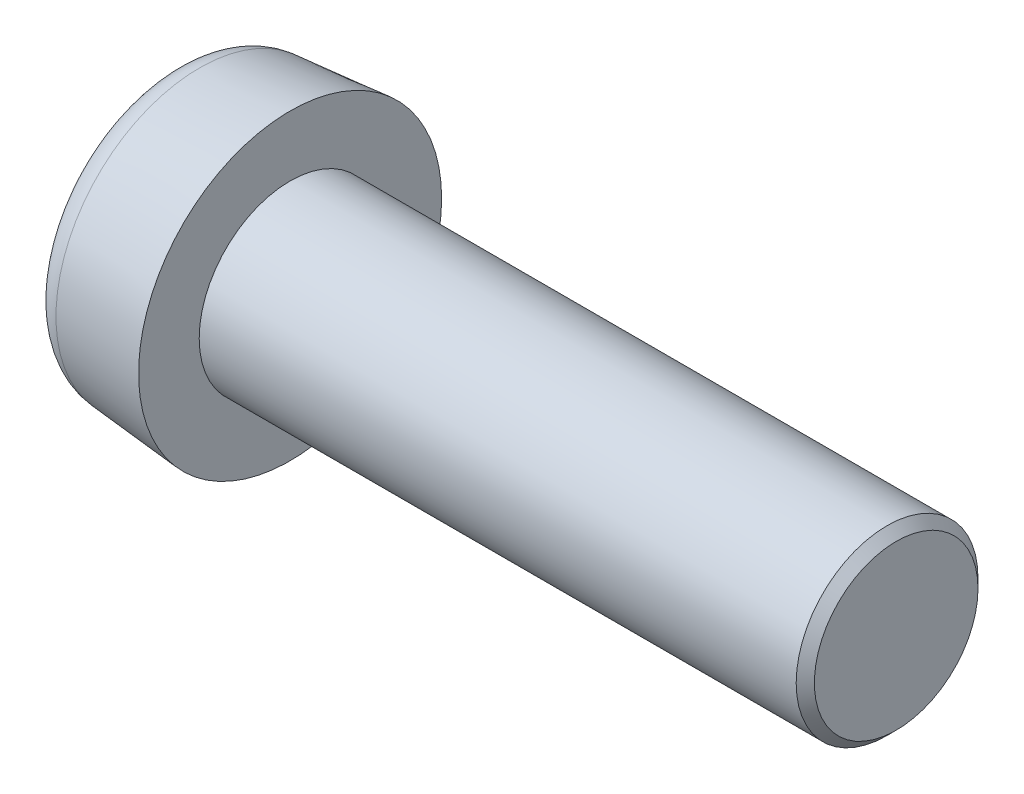
ISO-10303-21;
HEADER;
FILE_DESCRIPTION(('STEP AP214'),'2;1');
FILE_NAME('part.step','',(''),(''),'','','');
FILE_SCHEMA(('AUTOMOTIVE_DESIGN { 1 0 10303 214 1 1 1 1 }'));
ENDSEC;
DATA;
#1=APPLICATION_CONTEXT('core data for automotive mechanical design processes');
#2=APPLICATION_PROTOCOL_DEFINITION('international standard','automotive_design',2000,#1);
#3=PRODUCT_CONTEXT('',#1,'mechanical');
#4=PRODUCT('Part','Part','',(#3));
#5=PRODUCT_RELATED_PRODUCT_CATEGORY('part','',(#4));
#6=PRODUCT_DEFINITION_FORMATION('','',#4);
#7=PRODUCT_DEFINITION_CONTEXT('part definition',#1,'design');
#8=PRODUCT_DEFINITION('design','',#6,#7);
#9=PRODUCT_DEFINITION_SHAPE('','',#8);
#10=(LENGTH_UNIT() NAMED_UNIT(*) SI_UNIT(.MILLI.,.METRE.));
#11=(NAMED_UNIT(*) PLANE_ANGLE_UNIT() SI_UNIT($,.RADIAN.));
#12=(NAMED_UNIT(*) SI_UNIT($,.STERADIAN.) SOLID_ANGLE_UNIT());
#13=UNCERTAINTY_MEASURE_WITH_UNIT(LENGTH_MEASURE(1.E-05),#10,'distance_accuracy_value','');
#14=(GEOMETRIC_REPRESENTATION_CONTEXT(3) GLOBAL_UNCERTAINTY_ASSIGNED_CONTEXT((#13)) GLOBAL_UNIT_ASSIGNED_CONTEXT((#10,
#11,#12)) REPRESENTATION_CONTEXT('',''));
#15=CARTESIAN_POINT('',(0.,0.,0.));
#16=DIRECTION('',(0.,0.,1.));
#17=DIRECTION('',(1.,0.,0.));
#18=AXIS2_PLACEMENT_3D('',#15,#16,#17);
#19=CARTESIAN_POINT('',(0.,0.,0.));
#20=DIRECTION('',(1.,0.,0.));
#21=DIRECTION('',(0.,0.,-1.));
#22=AXIS2_PLACEMENT_3D('',#19,#20,#21);
#23=PLANE('',#22);
#24=CARTESIAN_POINT('',(0.,0.,0.));
#25=DIRECTION('',(1.,0.,0.));
#26=DIRECTION('',(0.,0.,-1.));
#27=AXIS2_PLACEMENT_3D('',#24,#25,#26);
#28=CIRCLE('',#27,3.74246303823147);
#29=CARTESIAN_POINT('',(0.,0.,-3.74246303823147));
#30=VERTEX_POINT('',#29);
#31=EDGE_CURVE('E136',#30,#30,#28,.F.);
#32=ORIENTED_EDGE('',*,*,#31,.T.);
#33=EDGE_LOOP('',(#32));
#34=FACE_BOUND('',#33,.T.);
#35=DIRECTION('',(0.,0.866025403784439,-0.5));
#36=VECTOR('',#35,1.);
#37=CARTESIAN_POINT('',(0.,-2.075,-1.19800180856848));
#38=LINE('',#37,#36);
#39=CARTESIAN_POINT('',(0.,-2.075,-1.19800180856848));
#40=VERTEX_POINT('',#39);
#41=CARTESIAN_POINT('',(0.,0.,-2.39600361713695));
#42=VERTEX_POINT('',#41);
#43=EDGE_CURVE('E52',#40,#42,#38,.T.);
#44=ORIENTED_EDGE('',*,*,#43,.T.);
#45=DIRECTION('',(0.,0.866025403784438,0.5));
#46=VECTOR('',#45,1.);
#47=CARTESIAN_POINT('',(0.,0.,-2.39600361713695));
#48=LINE('',#47,#46);
#49=CARTESIAN_POINT('',(0.,2.075,-1.19800180856847));
#50=VERTEX_POINT('',#49);
#51=EDGE_CURVE('E111',#42,#50,#48,.T.);
#52=ORIENTED_EDGE('',*,*,#51,.T.);
#53=DIRECTION('',(0.,0.,1.));
#54=VECTOR('',#53,1.);
#55=CARTESIAN_POINT('',(0.,2.075,-1.19800180856847));
#56=LINE('',#55,#54);
#57=CARTESIAN_POINT('',(0.,2.075,1.19800180856847));
#58=VERTEX_POINT('',#57);
#59=EDGE_CURVE('E109',#50,#58,#56,.T.);
#60=ORIENTED_EDGE('',*,*,#59,.T.);
#61=DIRECTION('',(0.,-0.866025403784438,0.5));
#62=VECTOR('',#61,1.);
#63=CARTESIAN_POINT('',(0.,2.075,1.19800180856847));
#64=LINE('',#63,#62);
#65=CARTESIAN_POINT('',(0.,0.,2.39600361713695));
#66=VERTEX_POINT('',#65);
#67=EDGE_CURVE('E88',#58,#66,#64,.T.);
#68=ORIENTED_EDGE('',*,*,#67,.T.);
#69=DIRECTION('',(0.,-0.866025403784438,-0.5));
#70=VECTOR('',#69,1.);
#71=CARTESIAN_POINT('',(0.,0.,2.39600361713695));
#72=LINE('',#71,#70);
#73=CARTESIAN_POINT('',(0.,-2.075,1.19800180856847));
#74=VERTEX_POINT('',#73);
#75=EDGE_CURVE('E99',#66,#74,#72,.T.);
#76=ORIENTED_EDGE('',*,*,#75,.T.);
#77=DIRECTION('',(0.,0.,-1.));
#78=VECTOR('',#77,1.);
#79=CARTESIAN_POINT('',(0.,-2.075,1.19800180856847));
#80=LINE('',#79,#78);
#81=EDGE_CURVE('E105',#74,#40,#80,.T.);
#82=ORIENTED_EDGE('',*,*,#81,.T.);
#83=EDGE_LOOP('',(#44,#52,#60,#68,#76,#82));
#84=FACE_BOUND('',#83,.T.);
#85=ADVANCED_FACE('F37',(#34,#84),#23,.F.);
#86=CARTESIAN_POINT('',(3.9,0.,0.));
#87=DIRECTION('',(1.,0.,0.));
#88=DIRECTION('',(0.,0.,-1.));
#89=AXIS2_PLACEMENT_3D('',#86,#87,#88);
#90=PLANE('',#89);
#91=CARTESIAN_POINT('',(3.9,0.,0.));
#92=DIRECTION('',(1.,0.,0.));
#93=DIRECTION('',(0.,0.,-1.));
#94=AXIS2_PLACEMENT_3D('',#91,#92,#93);
#95=CIRCLE('',#94,5.);
#96=CARTESIAN_POINT('',(3.9,0.,-5.));
#97=VERTEX_POINT('',#96);
#98=EDGE_CURVE('E129',#97,#97,#95,.T.);
#99=ORIENTED_EDGE('',*,*,#98,.T.);
#100=EDGE_LOOP('',(#99));
#101=FACE_BOUND('',#100,.T.);
#102=CARTESIAN_POINT('',(3.9,0.,0.));
#103=DIRECTION('',(1.,0.,0.));
#104=DIRECTION('',(0.,0.,-1.));
#105=AXIS2_PLACEMENT_3D('',#102,#103,#104);
#106=CIRCLE('',#105,3.);
#107=CARTESIAN_POINT('',(3.9,0.,-3.));
#108=VERTEX_POINT('',#107);
#109=EDGE_CURVE('E126',#108,#108,#106,.T.);
#110=ORIENTED_EDGE('',*,*,#109,.F.);
#111=EDGE_LOOP('',(#110));
#112=FACE_BOUND('',#111,.T.);
#113=ADVANCED_FACE('F153',(#101,#112),#90,.T.);
#114=CARTESIAN_POINT('',(3.9,0.,0.));
#115=DIRECTION('',(1.,0.,0.));
#116=DIRECTION('',(0.,0.,-1.));
#117=AXIS2_PLACEMENT_3D('',#114,#115,#116);
#118=CONICAL_SURFACE('',#117,5.,0.0872664625997167);
#119=CARTESIAN_POINT('',(0.912844257252342,0.,0.));
#120=DIRECTION('',(1.,0.,0.));
#121=DIRECTION('',(0.,0.,-1.));
#122=AXIS2_PLACEMENT_3D('',#119,#120,#121);
#123=CIRCLE('',#122,4.73865773632322);
#124=CARTESIAN_POINT('',(0.912844257252342,0.,-4.73865773632322));
#125=VERTEX_POINT('',#124);
#126=EDGE_CURVE('E133',#125,#125,#123,.T.);
#127=ORIENTED_EDGE('',*,*,#126,.T.);
#128=EDGE_LOOP('',(#127));
#129=FACE_BOUND('',#128,.T.);
#130=ORIENTED_EDGE('',*,*,#98,.F.);
#131=EDGE_LOOP('',(#130));
#132=FACE_BOUND('',#131,.T.);
#133=ADVANCED_FACE('F159',(#129,#132),#118,.T.);
#134=CARTESIAN_POINT('',(23.9,0.,0.));
#135=DIRECTION('',(-1.,0.,0.));
#136=DIRECTION('',(0.,0.,1.));
#137=AXIS2_PLACEMENT_3D('',#134,#135,#136);
#138=CYLINDRICAL_SURFACE('',#137,3.);
#139=CARTESIAN_POINT('',(23.6,0.,0.));
#140=DIRECTION('',(1.,0.,0.));
#141=DIRECTION('',(0.,0.,-1.));
#142=AXIS2_PLACEMENT_3D('',#139,#140,#141);
#143=CIRCLE('',#142,3.);
#144=CARTESIAN_POINT('',(23.6,0.,-3.));
#145=VERTEX_POINT('',#144);
#146=EDGE_CURVE('E11',#145,#145,#143,.F.);
#147=ORIENTED_EDGE('',*,*,#146,.T.);
#148=EDGE_LOOP('',(#147));
#149=FACE_BOUND('',#148,.T.);
#150=ORIENTED_EDGE('',*,*,#109,.T.);
#151=EDGE_LOOP('',(#150));
#152=FACE_BOUND('',#151,.T.);
#153=ADVANCED_FACE('F163',(#149,#152),#138,.T.);
#154=CARTESIAN_POINT('',(23.9,0.,0.));
#155=DIRECTION('',(1.,0.,0.));
#156=DIRECTION('',(0.,0.,-1.));
#157=AXIS2_PLACEMENT_3D('',#154,#155,#156);
#158=PLANE('',#157);
#159=CARTESIAN_POINT('',(23.9,0.,0.));
#160=DIRECTION('',(1.,0.,0.));
#161=DIRECTION('',(0.,0.,-1.));
#162=AXIS2_PLACEMENT_3D('',#159,#160,#161);
#163=CIRCLE('',#162,2.7);
#164=CARTESIAN_POINT('',(23.9,0.,-2.7));
#165=VERTEX_POINT('',#164);
#166=EDGE_CURVE('E45',#165,#165,#163,.T.);
#167=ORIENTED_EDGE('',*,*,#166,.T.);
#168=EDGE_LOOP('',(#167));
#169=FACE_BOUND('',#168,.T.);
#170=ADVANCED_FACE('F141',(#169),#158,.T.);
#171=CARTESIAN_POINT('',(2.,-2.075,-1.19800180856848));
#172=DIRECTION('',(0.,0.5,0.866025403784439));
#173=DIRECTION('',(0.,-0.866025403784439,0.5));
#174=AXIS2_PLACEMENT_3D('',#171,#172,#173);
#175=PLANE('',#174);
#176=ORIENTED_EDGE('',*,*,#43,.F.);
#177=DIRECTION('',(-1.,0.,0.));
#178=VECTOR('',#177,1.);
#179=CARTESIAN_POINT('',(2.,-2.075,-1.19800180856848));
#180=LINE('',#179,#178);
#181=CARTESIAN_POINT('',(2.,-2.075,-1.19800180856848));
#182=VERTEX_POINT('',#181);
#183=EDGE_CURVE('E117',#182,#40,#180,.T.);
#184=ORIENTED_EDGE('',*,*,#183,.F.);
#185=DIRECTION('',(0.,0.866025403784439,-0.5));
#186=VECTOR('',#185,1.);
#187=CARTESIAN_POINT('',(2.,-2.075,-1.19800180856848));
#188=LINE('',#187,#186);
#189=CARTESIAN_POINT('',(2.,0.,-2.39600361713695));
#190=VERTEX_POINT('',#189);
#191=EDGE_CURVE('E116',#182,#190,#188,.T.);
#192=ORIENTED_EDGE('',*,*,#191,.T.);
#193=DIRECTION('',(-1.,0.,0.));
#194=VECTOR('',#193,1.);
#195=CARTESIAN_POINT('',(2.,0.,-2.39600361713695));
#196=LINE('',#195,#194);
#197=EDGE_CURVE('E124',#190,#42,#196,.T.);
#198=ORIENTED_EDGE('',*,*,#197,.T.);
#199=EDGE_LOOP('',(#176,#184,#192,#198));
#200=FACE_BOUND('',#199,.T.);
#201=ADVANCED_FACE('F182',(#200),#175,.T.);
#202=CARTESIAN_POINT('',(2.,0.,-2.39600361713695));
#203=DIRECTION('',(0.,-0.5,0.866025403784438));
#204=DIRECTION('',(0.,-0.866025403784438,-0.5));
#205=AXIS2_PLACEMENT_3D('',#202,#203,#204);
#206=PLANE('',#205);
#207=ORIENTED_EDGE('',*,*,#51,.F.);
#208=ORIENTED_EDGE('',*,*,#197,.F.);
#209=DIRECTION('',(0.,0.866025403784438,0.5));
#210=VECTOR('',#209,1.);
#211=CARTESIAN_POINT('',(2.,0.,-2.39600361713695));
#212=LINE('',#211,#210);
#213=CARTESIAN_POINT('',(2.,2.075,-1.19800180856847));
#214=VERTEX_POINT('',#213);
#215=EDGE_CURVE('E255',#190,#214,#212,.T.);
#216=ORIENTED_EDGE('',*,*,#215,.T.);
#217=DIRECTION('',(-1.,0.,0.));
#218=VECTOR('',#217,1.);
#219=CARTESIAN_POINT('',(2.,2.075,-1.19800180856847));
#220=LINE('',#219,#218);
#221=EDGE_CURVE('E122',#214,#50,#220,.T.);
#222=ORIENTED_EDGE('',*,*,#221,.T.);
#223=EDGE_LOOP('',(#207,#208,#216,#222));
#224=FACE_BOUND('',#223,.T.);
#225=ADVANCED_FACE('F186',(#224),#206,.T.);
#226=CARTESIAN_POINT('',(2.,2.075,-1.19800180856847));
#227=DIRECTION('',(0.,-1.,0.));
#228=DIRECTION('',(0.,0.,-1.));
#229=AXIS2_PLACEMENT_3D('',#226,#227,#228);
#230=PLANE('',#229);
#231=ORIENTED_EDGE('',*,*,#59,.F.);
#232=ORIENTED_EDGE('',*,*,#221,.F.);
#233=DIRECTION('',(0.,0.,1.));
#234=VECTOR('',#233,1.);
#235=CARTESIAN_POINT('',(2.,2.075,-1.19800180856847));
#236=LINE('',#235,#234);
#237=CARTESIAN_POINT('',(2.,2.075,1.19800180856847));
#238=VERTEX_POINT('',#237);
#239=EDGE_CURVE('E61',#214,#238,#236,.T.);
#240=ORIENTED_EDGE('',*,*,#239,.T.);
#241=DIRECTION('',(-1.,0.,0.));
#242=VECTOR('',#241,1.);
#243=CARTESIAN_POINT('',(2.,2.075,1.19800180856847));
#244=LINE('',#243,#242);
#245=EDGE_CURVE('E95',#238,#58,#244,.T.);
#246=ORIENTED_EDGE('',*,*,#245,.T.);
#247=EDGE_LOOP('',(#231,#232,#240,#246));
#248=FACE_BOUND('',#247,.T.);
#249=ADVANCED_FACE('F191',(#248),#230,.T.);
#250=CARTESIAN_POINT('',(2.,2.075,1.19800180856847));
#251=DIRECTION('',(0.,-0.5,-0.866025403784438));
#252=DIRECTION('',(0.,0.866025403784439,-0.5));
#253=AXIS2_PLACEMENT_3D('',#250,#251,#252);
#254=PLANE('',#253);
#255=ORIENTED_EDGE('',*,*,#67,.F.);
#256=ORIENTED_EDGE('',*,*,#245,.F.);
#257=DIRECTION('',(0.,-0.866025403784438,0.5));
#258=VECTOR('',#257,1.);
#259=CARTESIAN_POINT('',(2.,2.075,1.19800180856847));
#260=LINE('',#259,#258);
#261=CARTESIAN_POINT('',(2.,0.,2.39600361713695));
#262=VERTEX_POINT('',#261);
#263=EDGE_CURVE('E92',#238,#262,#260,.T.);
#264=ORIENTED_EDGE('',*,*,#263,.T.);
#265=DIRECTION('',(-1.,0.,0.));
#266=VECTOR('',#265,1.);
#267=CARTESIAN_POINT('',(2.,0.,2.39600361713695));
#268=LINE('',#267,#266);
#269=EDGE_CURVE('E83',#262,#66,#268,.T.);
#270=ORIENTED_EDGE('',*,*,#269,.T.);
#271=EDGE_LOOP('',(#255,#256,#264,#270));
#272=FACE_BOUND('',#271,.T.);
#273=ADVANCED_FACE('F85',(#272),#254,.T.);
#274=CARTESIAN_POINT('',(2.,0.,2.39600361713695));
#275=DIRECTION('',(0.,0.5,-0.866025403784438));
#276=DIRECTION('',(0.,0.866025403784438,0.5));
#277=AXIS2_PLACEMENT_3D('',#274,#275,#276);
#278=PLANE('',#277);
#279=ORIENTED_EDGE('',*,*,#75,.F.);
#280=ORIENTED_EDGE('',*,*,#269,.F.);
#281=DIRECTION('',(0.,-0.866025403784438,-0.5));
#282=VECTOR('',#281,1.);
#283=CARTESIAN_POINT('',(2.,0.,2.39600361713695));
#284=LINE('',#283,#282);
#285=CARTESIAN_POINT('',(2.,-2.075,1.19800180856847));
#286=VERTEX_POINT('',#285);
#287=EDGE_CURVE('E230',#262,#286,#284,.T.);
#288=ORIENTED_EDGE('',*,*,#287,.T.);
#289=DIRECTION('',(-1.,0.,0.));
#290=VECTOR('',#289,1.);
#291=CARTESIAN_POINT('',(2.,-2.075,1.19800180856847));
#292=LINE('',#291,#290);
#293=EDGE_CURVE('E96',#286,#74,#292,.T.);
#294=ORIENTED_EDGE('',*,*,#293,.T.);
#295=EDGE_LOOP('',(#279,#280,#288,#294));
#296=FACE_BOUND('',#295,.T.);
#297=ADVANCED_FACE('F100',(#296),#278,.T.);
#298=CARTESIAN_POINT('',(2.,-2.075,1.19800180856847));
#299=DIRECTION('',(0.,1.,0.));
#300=DIRECTION('',(0.,0.,1.));
#301=AXIS2_PLACEMENT_3D('',#298,#299,#300);
#302=PLANE('',#301);
#303=ORIENTED_EDGE('',*,*,#81,.F.);
#304=ORIENTED_EDGE('',*,*,#293,.F.);
#305=DIRECTION('',(0.,0.,-1.));
#306=VECTOR('',#305,1.);
#307=CARTESIAN_POINT('',(2.,-2.075,1.19800180856847));
#308=LINE('',#307,#306);
#309=EDGE_CURVE('E119',#286,#182,#308,.T.);
#310=ORIENTED_EDGE('',*,*,#309,.T.);
#311=ORIENTED_EDGE('',*,*,#183,.T.);
#312=EDGE_LOOP('',(#303,#304,#310,#311));
#313=FACE_BOUND('',#312,.T.);
#314=ADVANCED_FACE('F200',(#313),#302,.T.);
#315=CARTESIAN_POINT('',(2.,0.,2.39600361713695));
#316=DIRECTION('',(0.86602540378444,-0.249999999999999,0.433012701892218));
#317=DIRECTION('',(0.447213595499956,0.,-0.894427190999917));
#318=AXIS2_PLACEMENT_3D('',#315,#316,#317);
#319=PLANE('',#318);
#320=ORIENTED_EDGE('',*,*,#287,.F.);
#321=DIRECTION('',(-0.447213595499956,0.,0.894427190999917));
#322=VECTOR('',#321,1.);
#323=CARTESIAN_POINT('',(2.,0.,2.39600361713695));
#324=LINE('',#323,#322);
#325=CARTESIAN_POINT('',(3.19800180856847,0.,0.));
#326=VERTEX_POINT('',#325);
#327=EDGE_CURVE('E232',#326,#262,#324,.T.);
#328=ORIENTED_EDGE('',*,*,#327,.F.);
#329=DIRECTION('',(-0.447213595499956,-0.774596669241484,0.447213595499958));
#330=VECTOR('',#329,1.);
#331=CARTESIAN_POINT('',(2.,-2.075,1.19800180856847));
#332=LINE('',#331,#330);
#333=EDGE_CURVE('E235',#326,#286,#332,.T.);
#334=ORIENTED_EDGE('',*,*,#333,.T.);
#335=EDGE_LOOP('',(#320,#328,#334));
#336=FACE_BOUND('',#335,.T.);
#337=ADVANCED_FACE('F203',(#336),#319,.F.);
#338=CARTESIAN_POINT('',(2.,-2.075,1.19800180856847));
#339=DIRECTION('',(0.86602540378444,-0.499999999999998,0.));
#340=DIRECTION('',(0.499999999999998,0.86602540378444,0.));
#341=AXIS2_PLACEMENT_3D('',#338,#339,#340);
#342=PLANE('',#341);
#343=ORIENTED_EDGE('',*,*,#309,.F.);
#344=ORIENTED_EDGE('',*,*,#333,.F.);
#345=DIRECTION('',(-0.447213595499956,-0.774596669241484,-0.447213595499958));
#346=VECTOR('',#345,1.);
#347=CARTESIAN_POINT('',(2.,-2.075,-1.19800180856848));
#348=LINE('',#347,#346);
#349=EDGE_CURVE('E259',#326,#182,#348,.T.);
#350=ORIENTED_EDGE('',*,*,#349,.T.);
#351=EDGE_LOOP('',(#343,#344,#350));
#352=FACE_BOUND('',#351,.T.);
#353=ADVANCED_FACE('F205',(#352),#342,.F.);
#354=CARTESIAN_POINT('',(2.,-2.075,-1.19800180856848));
#355=DIRECTION('',(0.86602540378444,-0.249999999999999,-0.433012701892218));
#356=DIRECTION('',(-0.447213595499956,0.,-0.894427190999917));
#357=AXIS2_PLACEMENT_3D('',#354,#355,#356);
#358=PLANE('',#357);
#359=ORIENTED_EDGE('',*,*,#191,.F.);
#360=ORIENTED_EDGE('',*,*,#349,.F.);
#361=DIRECTION('',(-0.447213595499956,0.,-0.894427190999917));
#362=VECTOR('',#361,1.);
#363=CARTESIAN_POINT('',(2.,0.,-2.39600361713695));
#364=LINE('',#363,#362);
#365=EDGE_CURVE('E267',#326,#190,#364,.T.);
#366=ORIENTED_EDGE('',*,*,#365,.T.);
#367=EDGE_LOOP('',(#359,#360,#366));
#368=FACE_BOUND('',#367,.T.);
#369=ADVANCED_FACE('F208',(#368),#358,.F.);
#370=CARTESIAN_POINT('',(2.,0.,-2.39600361713695));
#371=DIRECTION('',(0.86602540378444,0.249999999999999,-0.433012701892218));
#372=DIRECTION('',(-0.447213595499956,0.,-0.894427190999917));
#373=AXIS2_PLACEMENT_3D('',#370,#371,#372);
#374=PLANE('',#373);
#375=ORIENTED_EDGE('',*,*,#215,.F.);
#376=ORIENTED_EDGE('',*,*,#365,.F.);
#377=DIRECTION('',(-0.447213595499956,0.774596669241484,-0.447213595499958));
#378=VECTOR('',#377,1.);
#379=CARTESIAN_POINT('',(2.,2.075,-1.19800180856847));
#380=LINE('',#379,#378);
#381=EDGE_CURVE('E269',#326,#214,#380,.T.);
#382=ORIENTED_EDGE('',*,*,#381,.T.);
#383=EDGE_LOOP('',(#375,#376,#382));
#384=FACE_BOUND('',#383,.T.);
#385=ADVANCED_FACE('F212',(#384),#374,.F.);
#386=CARTESIAN_POINT('',(2.,2.075,-1.19800180856847));
#387=DIRECTION('',(0.86602540378444,0.499999999999998,0.));
#388=DIRECTION('',(-0.499999999999998,0.86602540378444,0.));
#389=AXIS2_PLACEMENT_3D('',#386,#387,#388);
#390=PLANE('',#389);
#391=ORIENTED_EDGE('',*,*,#239,.F.);
#392=ORIENTED_EDGE('',*,*,#381,.F.);
#393=DIRECTION('',(-0.447213595499956,0.774596669241484,0.447213595499958));
#394=VECTOR('',#393,1.);
#395=CARTESIAN_POINT('',(2.,2.075,1.19800180856847));
#396=LINE('',#395,#394);
#397=EDGE_CURVE('E263',#326,#238,#396,.T.);
#398=ORIENTED_EDGE('',*,*,#397,.T.);
#399=EDGE_LOOP('',(#391,#392,#398));
#400=FACE_BOUND('',#399,.T.);
#401=ADVANCED_FACE('F216',(#400),#390,.F.);
#402=CARTESIAN_POINT('',(2.,2.075,1.19800180856847));
#403=DIRECTION('',(0.86602540378444,0.249999999999999,0.433012701892218));
#404=DIRECTION('',(0.447213595499956,0.,-0.894427190999917));
#405=AXIS2_PLACEMENT_3D('',#402,#403,#404);
#406=PLANE('',#405);
#407=ORIENTED_EDGE('',*,*,#263,.F.);
#408=ORIENTED_EDGE('',*,*,#397,.F.);
#409=ORIENTED_EDGE('',*,*,#327,.T.);
#410=EDGE_LOOP('',(#407,#408,#409));
#411=FACE_BOUND('',#410,.T.);
#412=ADVANCED_FACE('F149',(#411),#406,.F.);
#413=CARTESIAN_POINT('',(1.,0.,0.));
#414=DIRECTION('',(1.,0.,0.));
#415=DIRECTION('',(0.,0.,-1.));
#416=AXIS2_PLACEMENT_3D('',#413,#414,#415);
#417=TOROIDAL_SURFACE('',#416,3.74246303823147,1.);
#418=ORIENTED_EDGE('',*,*,#31,.F.);
#419=EDGE_LOOP('',(#418));
#420=FACE_BOUND('',#419,.T.);
#421=ORIENTED_EDGE('',*,*,#126,.F.);
#422=EDGE_LOOP('',(#421));
#423=FACE_BOUND('',#422,.T.);
#424=ADVANCED_FACE('F144',(#420,#423),#417,.T.);
#425=CARTESIAN_POINT('',(23.9,0.,0.));
#426=DIRECTION('',(-1.,0.,0.));
#427=DIRECTION('',(0.,0.,1.));
#428=AXIS2_PLACEMENT_3D('',#425,#426,#427);
#429=CONICAL_SURFACE('',#428,2.7,0.78539816339745);
#430=ORIENTED_EDGE('',*,*,#146,.F.);
#431=EDGE_LOOP('',(#430));
#432=FACE_BOUND('',#431,.T.);
#433=ORIENTED_EDGE('',*,*,#166,.F.);
#434=EDGE_LOOP('',(#433));
#435=FACE_BOUND('',#434,.T.);
#436=ADVANCED_FACE('F39',(#432,#435),#429,.T.);
#437=CLOSED_SHELL('',(#85,#113,#133,#153,#170,#201,#225,#249,#273,#297,#314,#337,#353,#369,#385,
#401,#412,#424,#436));
#438=MANIFOLD_SOLID_BREP('B2',#437);
#439=ADVANCED_BREP_SHAPE_REPRESENTATION('',(#18,#438),#14);
#440=SHAPE_DEFINITION_REPRESENTATION(#9,#439);
ENDSEC;
END-ISO-10303-21;
